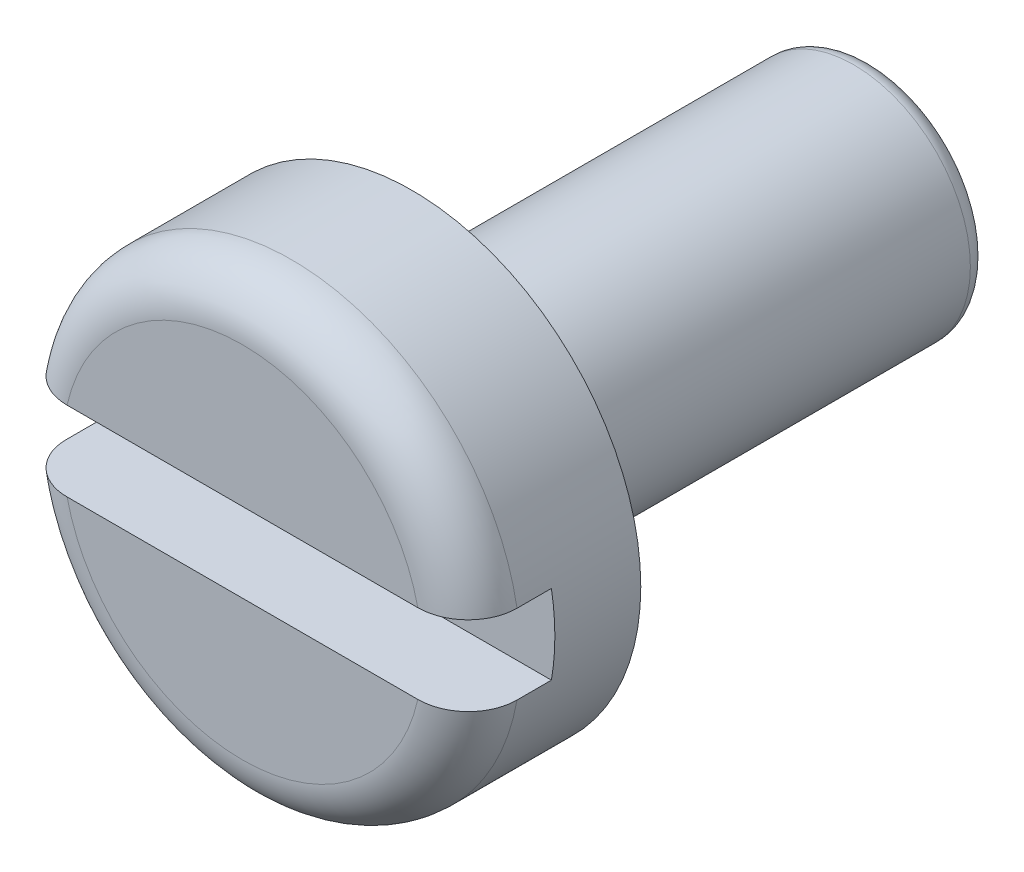
ISO-10303-21;
HEADER;
FILE_DESCRIPTION(('STEP AP214'),'2;1');
FILE_NAME('part.step','',(''),(''),'','','');
FILE_SCHEMA(('AUTOMOTIVE_DESIGN { 1 0 10303 214 1 1 1 1 }'));
ENDSEC;
DATA;
#1=APPLICATION_CONTEXT('core data for automotive mechanical design processes');
#2=APPLICATION_PROTOCOL_DEFINITION('international standard','automotive_design',2000,#1);
#3=PRODUCT_CONTEXT('',#1,'mechanical');
#4=PRODUCT('Part','Part','',(#3));
#5=PRODUCT_RELATED_PRODUCT_CATEGORY('part','',(#4));
#6=PRODUCT_DEFINITION_FORMATION('','',#4);
#7=PRODUCT_DEFINITION_CONTEXT('part definition',#1,'design');
#8=PRODUCT_DEFINITION('design','',#6,#7);
#9=PRODUCT_DEFINITION_SHAPE('','',#8);
#10=(LENGTH_UNIT() NAMED_UNIT(*) SI_UNIT(.MILLI.,.METRE.));
#11=(NAMED_UNIT(*) PLANE_ANGLE_UNIT() SI_UNIT($,.RADIAN.));
#12=(NAMED_UNIT(*) SI_UNIT($,.STERADIAN.) SOLID_ANGLE_UNIT());
#13=UNCERTAINTY_MEASURE_WITH_UNIT(LENGTH_MEASURE(1.E-05),#10,'distance_accuracy_value','');
#14=(GEOMETRIC_REPRESENTATION_CONTEXT(3) GLOBAL_UNCERTAINTY_ASSIGNED_CONTEXT((#13)) GLOBAL_UNIT_ASSIGNED_CONTEXT((#10,
#11,#12)) REPRESENTATION_CONTEXT('',''));
#15=CARTESIAN_POINT('',(0.,0.,0.));
#16=DIRECTION('',(0.,0.,1.));
#17=DIRECTION('',(1.,0.,0.));
#18=AXIS2_PLACEMENT_3D('',#15,#16,#17);
#19=CARTESIAN_POINT('',(19.4446915004468,16.1091221627203,1.778));
#20=DIRECTION('',(0.,0.,1.));
#21=DIRECTION('',(1.,0.,0.));
#22=AXIS2_PLACEMENT_3D('',#19,#20,#21);
#23=PLANE('',#22);
#24=DIRECTION('',(1.,0.,0.));
#25=VECTOR('',#24,1.);
#26=CARTESIAN_POINT('',(23.6792892297838,16.9310847197979,1.778));
#27=LINE('',#26,#25);
#28=CARTESIAN_POINT('',(14.3488028620188,16.9310847197979,1.778));
#29=VERTEX_POINT('',#28);
#30=CARTESIAN_POINT('',(23.6792892297839,16.9310847197979,1.778));
#31=VERTEX_POINT('',#30);
#32=EDGE_CURVE('E78',#29,#31,#27,.T.);
#33=ORIENTED_EDGE('',*,*,#32,.F.);
#34=CARTESIAN_POINT('',(19.0140460459013,16.1091221627203,1.778));
#35=DIRECTION('',(0.,0.,1.));
#36=DIRECTION('',(1.,0.,0.));
#37=AXIS2_PLACEMENT_3D('',#34,#35,#36);
#38=CIRCLE('',#37,4.7371);
#39=CARTESIAN_POINT('',(14.3488028620188,15.2871596056426,1.778));
#40=VERTEX_POINT('',#39);
#41=EDGE_CURVE('E84',#29,#40,#38,.T.);
#42=ORIENTED_EDGE('',*,*,#41,.T.);
#43=DIRECTION('',(1.,0.,0.));
#44=VECTOR('',#43,1.);
#45=CARTESIAN_POINT('',(14.3488028620188,15.2871596056426,1.778));
#46=LINE('',#45,#44);
#47=CARTESIAN_POINT('',(23.6792892297839,15.2871596056426,1.778));
#48=VERTEX_POINT('',#47);
#49=EDGE_CURVE('E81',#48,#40,#46,.F.);
#50=ORIENTED_EDGE('',*,*,#49,.F.);
#51=CARTESIAN_POINT('',(19.0140460459013,16.1091221627203,1.778));
#52=DIRECTION('',(0.,0.,1.));
#53=DIRECTION('',(1.,0.,0.));
#54=AXIS2_PLACEMENT_3D('',#51,#52,#53);
#55=CIRCLE('',#54,4.7371);
#56=EDGE_CURVE('E75',#48,#31,#55,.T.);
#57=ORIENTED_EDGE('',*,*,#56,.T.);
#58=EDGE_LOOP('',(#33,#42,#50,#57));
#59=FACE_BOUND('',#58,.T.);
#60=ADVANCED_FACE('F17',(#59),#23,.T.);
#61=CARTESIAN_POINT('',(23.6792892297838,16.9310847197979,1.778));
#62=DIRECTION('',(0.,-1.,0.));
#63=DIRECTION('',(0.,0.,-1.));
#64=AXIS2_PLACEMENT_3D('',#61,#62,#63);
#65=PLANE('',#64);
#66=CARTESIAN_POINT('',(23.6792892297839,16.9310847197979,2.4892));
#67=CARTESIAN_POINT('',(23.6792892063526,16.9310847197979,2.5174491265254));
#68=CARTESIAN_POINT('',(23.6780921407475,16.9310847197979,2.54568462066357));
#69=CARTESIAN_POINT('',(23.6733177682975,16.9310847197979,2.60195160658094));
#70=CARTESIAN_POINT('',(23.669740630884,16.9310847197979,2.62998311273794));
#71=CARTESIAN_POINT('',(23.6554788134015,16.9310847197979,2.71340034037747));
#72=CARTESIAN_POINT('',(23.6412635978045,16.9310847197979,2.76822409391845));
#73=CARTESIAN_POINT('',(23.6038416377336,16.9310847197979,2.87469974773668));
#74=CARTESIAN_POINT('',(23.5806316532308,16.9310847197979,2.92635049728215));
#75=CARTESIAN_POINT('',(23.5259159560777,16.9310847197979,3.0250549750456));
#76=CARTESIAN_POINT('',(23.4944108541394,16.9310847197979,3.07210904133609));
#77=CARTESIAN_POINT('',(23.423842707384,16.9310847197979,3.16058570299452));
#78=CARTESIAN_POINT('',(23.3847376396854,16.9310847197979,3.20197469914298));
#79=CARTESIAN_POINT('',(23.3001945964242,16.9310847197979,3.27772845351746));
#80=CARTESIAN_POINT('',(23.2547558661494,16.9310847197979,3.31209237343764));
#81=CARTESIAN_POINT('',(23.1825224581939,16.9310847197979,3.3579131409865));
#82=CARTESIAN_POINT('',(23.157553528936,16.9310847197979,3.37232219211086));
#83=CARTESIAN_POINT('',(23.1065314402984,16.9310847197979,3.39900777366857));
#84=CARTESIAN_POINT('',(23.0804792844545,16.9310847197979,3.41128622569577));
#85=CARTESIAN_POINT('',(23.0009220754235,16.9310847197979,3.44482606750229));
#86=CARTESIAN_POINT('',(22.9459850058441,16.9310847197979,3.46281170821925));
#87=CARTESIAN_POINT('',(22.8495800082993,16.9310847197979,3.48584980100737));
#88=CARTESIAN_POINT('',(22.8086154967982,16.9310847197979,3.49310803437703));
#89=CARTESIAN_POINT('',(22.7261829381709,16.9310847197979,3.50278163768648));
#90=CARTESIAN_POINT('',(22.6847157766486,16.9310847197979,3.50520454786139));
#91=CARTESIAN_POINT('',(22.6432281527627,16.9310847197979,3.5052));
#92=B_SPLINE_CURVE_WITH_KNOTS('',3,(#66,#67,#68,#69,#70,#71,#72,#73,#74,#75,#76,#77,#78,#79,#80,
#81,#82,#83,#84,#85,#86,#87,#88,#89,#90,#91),.UNSPECIFIED.,.F.,.F.,(4,2,2,2,2,2,2,2,2,2,2,2,4),
(0.,0.0846949954202175,0.169383962262638,0.338420356504397,0.507517696459946,0.676602590426454,
0.846650474593889,1.01671863883047,1.1031162576973,1.18943554463901,1.36196445926495,
1.48650931461939,1.61085980166377),.UNSPECIFIED.);
#93=CARTESIAN_POINT('',(23.6792892297839,16.9310847197979,2.4892));
#94=VERTEX_POINT('',#93);
#95=CARTESIAN_POINT('',(22.6432281527627,16.9310847197979,3.5052));
#96=VERTEX_POINT('',#95);
#97=EDGE_CURVE('E94',#94,#96,#92,.T.);
#98=ORIENTED_EDGE('',*,*,#97,.T.);
#99=DIRECTION('',(1.,0.,0.));
#100=VECTOR('',#99,1.);
#101=CARTESIAN_POINT('',(19.0140460459013,16.9310847197979,3.5052));
#102=LINE('',#101,#100);
#103=CARTESIAN_POINT('',(15.38486393904,16.9310847197979,3.5052));
#104=VERTEX_POINT('',#103);
#105=EDGE_CURVE('E112',#104,#96,#102,.T.);
#106=ORIENTED_EDGE('',*,*,#105,.F.);
#107=CARTESIAN_POINT('',(15.38486393904,16.9310847197979,3.5052));
#108=CARTESIAN_POINT('',(15.3256062304906,16.9310847197979,3.50524216652295));
#109=CARTESIAN_POINT('',(15.2663582470057,16.9310847197979,3.5002695278891));
#110=CARTESIAN_POINT('',(15.1495113734863,16.9310847197979,3.48054079903096));
#111=CARTESIAN_POINT('',(15.0919125817738,16.9310847197979,3.46578412676145));
#112=CARTESIAN_POINT('',(14.9799482453991,16.9310847197979,3.42671507373036));
#113=CARTESIAN_POINT('',(14.9255858106557,16.9310847197979,3.40239366727017));
#114=CARTESIAN_POINT('',(14.8478224559974,16.9310847197979,3.35927752785438));
#115=CARTESIAN_POINT('',(14.8225319564271,16.9310847197979,3.34380026680798));
#116=CARTESIAN_POINT('',(14.7733472613481,16.9310847197979,3.31071421394008));
#117=CARTESIAN_POINT('',(14.7494545187289,16.9310847197979,3.29310326065578));
#118=CARTESIAN_POINT('',(14.6809163919177,16.9310847197979,3.23783984789326));
#119=CARTESIAN_POINT('',(14.6385606762497,16.9310847197979,3.19728367060158));
#120=CARTESIAN_POINT('',(14.5614320007916,16.9310847197979,3.10951213269995));
#121=CARTESIAN_POINT('',(14.5266577316589,16.9310847197979,3.0622979242787));
#122=CARTESIAN_POINT('',(14.481279667257,16.9310847197979,2.98800438802019));
#123=CARTESIAN_POINT('',(14.467375925529,16.9310847197979,2.96289246214314));
#124=CARTESIAN_POINT('',(14.4417679831849,16.9310847197979,2.91160143652602));
#125=CARTESIAN_POINT('',(14.4300618658813,16.9310847197979,2.88542329118597));
#126=CARTESIAN_POINT('',(14.398380586863,16.9310847197979,2.80554479843874));
#127=CARTESIAN_POINT('',(14.3818031741195,16.9310847197979,2.75043595226765));
#128=CARTESIAN_POINT('',(14.3629904488666,16.9310847197979,2.6606309180588));
#129=CARTESIAN_POINT('',(14.3576729807538,16.9310847197979,2.626538486424));
#130=CARTESIAN_POINT('',(14.3505813456247,16.9310847197979,2.55803805796265));
#131=CARTESIAN_POINT('',(14.3488019495207,16.9310847197979,2.52363060245309));
#132=CARTESIAN_POINT('',(14.3488028620188,16.9310847197978,2.48920000000004));
#133=B_SPLINE_CURVE_WITH_KNOTS('',3,(#107,#108,#109,#110,#111,#112,#113,#114,#115,#116,#117,
#118,#119,#120,#121,#122,#123,#124,#125,#126,#127,#128,#129,#130,#131,#132),.UNSPECIFIED.,.F.,
.F.,(4,2,2,2,2,2,2,2,2,2,2,2,4),(0.,0.177544868014859,0.355100298995844,0.532823682587418,
0.621681052678553,0.710629201323233,0.885644800059263,1.06063014899723,1.14664985557212,
1.23259418678876,1.40425921867969,1.5076123091705,1.61081253525624),.UNSPECIFIED.);
#134=CARTESIAN_POINT('',(14.3488028620188,16.9310847197979,2.4892));
#135=VERTEX_POINT('',#134);
#136=EDGE_CURVE('E100',#104,#135,#133,.T.);
#137=ORIENTED_EDGE('',*,*,#136,.T.);
#138=DIRECTION('',(0.,0.,-1.));
#139=VECTOR('',#138,1.);
#140=CARTESIAN_POINT('',(14.3488028620188,16.9310847197979,1.778));
#141=LINE('',#140,#139);
#142=EDGE_CURVE('E98',#135,#29,#141,.T.);
#143=ORIENTED_EDGE('',*,*,#142,.T.);
#144=ORIENTED_EDGE('',*,*,#32,.T.);
#145=DIRECTION('',(0.,0.,-1.));
#146=VECTOR('',#145,1.);
#147=CARTESIAN_POINT('',(23.6792892297838,16.9310847197979,1.778));
#148=LINE('',#147,#146);
#149=EDGE_CURVE('E88',#31,#94,#148,.F.);
#150=ORIENTED_EDGE('',*,*,#149,.T.);
#151=EDGE_LOOP('',(#98,#106,#137,#143,#144,#150));
#152=FACE_BOUND('',#151,.T.);
#153=ADVANCED_FACE('F96',(#152),#65,.T.);
#154=CARTESIAN_POINT('',(14.3488028620188,15.2871596056426,1.778));
#155=DIRECTION('',(0.,1.,0.));
#156=DIRECTION('',(0.,0.,1.));
#157=AXIS2_PLACEMENT_3D('',#154,#155,#156);
#158=PLANE('',#157);
#159=CARTESIAN_POINT('',(14.3488028620188,15.2871596056426,2.4892));
#160=CARTESIAN_POINT('',(14.34880288545,15.2871596056426,2.5174491265254));
#161=CARTESIAN_POINT('',(14.3499999510552,15.2871596056426,2.54568462066357));
#162=CARTESIAN_POINT('',(14.3547743235051,15.2871596056426,2.60195160658093));
#163=CARTESIAN_POINT('',(14.3583514609186,15.2871596056426,2.62998311273793));
#164=CARTESIAN_POINT('',(14.3726132784011,15.2871596056426,2.71340034037747));
#165=CARTESIAN_POINT('',(14.3868284939981,15.2871596056426,2.76822409391845));
#166=CARTESIAN_POINT('',(14.4242504540691,15.2871596056426,2.87469974773668));
#167=CARTESIAN_POINT('',(14.4474604385719,15.2871596056426,2.92635049728215));
#168=CARTESIAN_POINT('',(14.502176135725,15.2871596056426,3.0250549750456));
#169=CARTESIAN_POINT('',(14.5336812376632,15.2871596056426,3.07210904133609));
#170=CARTESIAN_POINT('',(14.6042493844186,15.2871596056426,3.16058570299452));
#171=CARTESIAN_POINT('',(14.6433544521173,15.2871596056426,3.20197469914298));
#172=CARTESIAN_POINT('',(14.7278974953785,15.2871596056426,3.27772845351746));
#173=CARTESIAN_POINT('',(14.7733362256533,15.2871596056426,3.31209237343764));
#174=CARTESIAN_POINT('',(14.8455696336087,15.2871596056426,3.3579131409865));
#175=CARTESIAN_POINT('',(14.8705385628666,15.2871596056426,3.37232219211086));
#176=CARTESIAN_POINT('',(14.9215606515043,15.2871596056426,3.39900777366857));
#177=CARTESIAN_POINT('',(14.9476128073482,15.2871596056426,3.41128622569577));
#178=CARTESIAN_POINT('',(15.0271700163792,15.2871596056426,3.44482606750229));
#179=CARTESIAN_POINT('',(15.0821070859585,15.2871596056426,3.46281170821925));
#180=CARTESIAN_POINT('',(15.1785120835034,15.2871596056426,3.48584980100737));
#181=CARTESIAN_POINT('',(15.2194765950045,15.2871596056426,3.49310803437703));
#182=CARTESIAN_POINT('',(15.3019091536318,15.2871596056426,3.50278163768648));
#183=CARTESIAN_POINT('',(15.343376315154,15.2871596056426,3.50520454786139));
#184=CARTESIAN_POINT('',(15.38486393904,15.2871596056426,3.5052));
#185=B_SPLINE_CURVE_WITH_KNOTS('',3,(#159,#160,#161,#162,#163,#164,#165,#166,#167,#168,#169,
#170,#171,#172,#173,#174,#175,#176,#177,#178,#179,#180,#181,#182,#183,#184),.UNSPECIFIED.,.F.,
.F.,(4,2,2,2,2,2,2,2,2,2,2,2,4),(0.,0.0846949954202172,0.169383962262637,0.338420356504396,
0.507517696459945,0.676602590426453,0.846650474593889,1.01671863883047,1.1031162576973,
1.18943554463901,1.36196445926495,1.4865093146194,1.61085980166377),.UNSPECIFIED.);
#186=CARTESIAN_POINT('',(14.3488028620188,15.2871596056426,2.4892));
#187=VERTEX_POINT('',#186);
#188=CARTESIAN_POINT('',(15.38486393904,15.2871596056426,3.5052));
#189=VERTEX_POINT('',#188);
#190=EDGE_CURVE('E110',#187,#189,#185,.T.);
#191=ORIENTED_EDGE('',*,*,#190,.T.);
#192=DIRECTION('',(1.,0.,0.));
#193=VECTOR('',#192,1.);
#194=CARTESIAN_POINT('',(19.0140460459013,15.2871596056426,3.5052));
#195=LINE('',#194,#193);
#196=CARTESIAN_POINT('',(22.6432281527627,15.2871596056426,3.5052));
#197=VERTEX_POINT('',#196);
#198=EDGE_CURVE('E161',#197,#189,#195,.F.);
#199=ORIENTED_EDGE('',*,*,#198,.F.);
#200=CARTESIAN_POINT('',(22.6432281527627,15.2871596056426,3.5052));
#201=CARTESIAN_POINT('',(22.702485861312,15.2871596056426,3.50524216652295));
#202=CARTESIAN_POINT('',(22.761733844797,15.2871596056426,3.5002695278891));
#203=CARTESIAN_POINT('',(22.8785807183163,15.2871596056426,3.48054079903096));
#204=CARTESIAN_POINT('',(22.9361795100289,15.2871596056426,3.46578412676145));
#205=CARTESIAN_POINT('',(23.0481438464036,15.2871596056426,3.42671507373036));
#206=CARTESIAN_POINT('',(23.102506281147,15.2871596056426,3.40239366727016));
#207=CARTESIAN_POINT('',(23.1802696358053,15.2871596056426,3.35927752785438));
#208=CARTESIAN_POINT('',(23.2055601353756,15.2871596056426,3.34380026680798));
#209=CARTESIAN_POINT('',(23.2547448304546,15.2871596056426,3.31071421394008));
#210=CARTESIAN_POINT('',(23.2786375730738,15.2871596056426,3.29310326065578));
#211=CARTESIAN_POINT('',(23.3471756998849,15.2871596056426,3.23783984789326));
#212=CARTESIAN_POINT('',(23.389531415553,15.2871596056426,3.19728367060158));
#213=CARTESIAN_POINT('',(23.4666600910111,15.2871596056426,3.10951213269995));
#214=CARTESIAN_POINT('',(23.5014343601437,15.2871596056426,3.0622979242787));
#215=CARTESIAN_POINT('',(23.5468124245456,15.2871596056426,2.98800438802019));
#216=CARTESIAN_POINT('',(23.5607161662736,15.2871596056426,2.96289246214314));
#217=CARTESIAN_POINT('',(23.5863241086178,15.2871596056426,2.91160143652602));
#218=CARTESIAN_POINT('',(23.5980302259213,15.2871596056426,2.88542329118597));
#219=CARTESIAN_POINT('',(23.6297115049397,15.2871596056426,2.80554479843874));
#220=CARTESIAN_POINT('',(23.6462889176832,15.2871596056426,2.75043595226765));
#221=CARTESIAN_POINT('',(23.665101642936,15.2871596056426,2.6606309180588));
#222=CARTESIAN_POINT('',(23.6704191110488,15.2871596056426,2.62653848642399));
#223=CARTESIAN_POINT('',(23.677510746178,15.2871596056426,2.55803805796265));
#224=CARTESIAN_POINT('',(23.679290142282,15.2871596056426,2.52363060245309));
#225=CARTESIAN_POINT('',(23.6792892297839,15.2871596056427,2.48920000000004));
#226=B_SPLINE_CURVE_WITH_KNOTS('',3,(#200,#201,#202,#203,#204,#205,#206,#207,#208,#209,#210,
#211,#212,#213,#214,#215,#216,#217,#218,#219,#220,#221,#222,#223,#224,#225),.UNSPECIFIED.,.F.,
.F.,(4,2,2,2,2,2,2,2,2,2,2,2,4),(0.,0.177544868014855,0.35510029899584,0.532823682587413,
0.621681052678549,0.710629201323226,0.885644800059253,1.06063014899722,1.14664985557211,
1.23259418678875,1.40425921867969,1.50761230917049,1.61081253525623),.UNSPECIFIED.);
#227=CARTESIAN_POINT('',(23.6792892297839,15.2871596056426,2.4892));
#228=VERTEX_POINT('',#227);
#229=EDGE_CURVE('E121',#197,#228,#226,.T.);
#230=ORIENTED_EDGE('',*,*,#229,.T.);
#231=DIRECTION('',(0.,0.,1.));
#232=VECTOR('',#231,1.);
#233=CARTESIAN_POINT('',(23.6792892297838,15.2871596056426,1.778));
#234=LINE('',#233,#232);
#235=EDGE_CURVE('E204',#228,#48,#234,.F.);
#236=ORIENTED_EDGE('',*,*,#235,.T.);
#237=ORIENTED_EDGE('',*,*,#49,.T.);
#238=DIRECTION('',(0.,0.,1.));
#239=VECTOR('',#238,1.);
#240=CARTESIAN_POINT('',(14.3488028620188,15.2871596056426,1.778));
#241=LINE('',#240,#239);
#242=EDGE_CURVE('E113',#40,#187,#241,.T.);
#243=ORIENTED_EDGE('',*,*,#242,.T.);
#244=EDGE_LOOP('',(#191,#199,#230,#236,#237,#243));
#245=FACE_BOUND('',#244,.T.);
#246=ADVANCED_FACE('F123',(#245),#158,.T.);
#247=CARTESIAN_POINT('',(19.0140460459013,18.2623661873274,3.5052));
#248=DIRECTION('',(0.,0.,1.));
#249=DIRECTION('',(1.,0.,0.));
#250=AXIS2_PLACEMENT_3D('',#247,#248,#249);
#251=PLANE('',#250);
#252=CARTESIAN_POINT('',(19.0140460459013,16.1091221627203,3.5052));
#253=DIRECTION('',(0.,0.,-1.));
#254=DIRECTION('',(-0.975298193238915,0.220892359000731,0.));
#255=AXIS2_PLACEMENT_3D('',#252,#253,#254);
#256=CIRCLE('',#255,3.7211);
#257=EDGE_CURVE('E193',#104,#96,#256,.T.);
#258=ORIENTED_EDGE('',*,*,#257,.F.);
#259=ORIENTED_EDGE('',*,*,#105,.T.);
#260=EDGE_LOOP('',(#258,#259));
#261=FACE_BOUND('',#260,.T.);
#262=ADVANCED_FACE('F171',(#261),#251,.T.);
#263=CARTESIAN_POINT('',(19.0140460459013,13.9558781381131,3.5052));
#264=DIRECTION('',(0.,0.,1.));
#265=DIRECTION('',(1.,0.,0.));
#266=AXIS2_PLACEMENT_3D('',#263,#264,#265);
#267=PLANE('',#266);
#268=CARTESIAN_POINT('',(19.0140460459013,16.1091221627203,3.5052));
#269=DIRECTION('',(0.,0.,-1.));
#270=DIRECTION('',(0.975298193238914,-0.220892359000736,0.));
#271=AXIS2_PLACEMENT_3D('',#268,#269,#270);
#272=CIRCLE('',#271,3.7211);
#273=EDGE_CURVE('E152',#197,#189,#272,.T.);
#274=ORIENTED_EDGE('',*,*,#273,.F.);
#275=ORIENTED_EDGE('',*,*,#198,.T.);
#276=EDGE_LOOP('',(#274,#275));
#277=FACE_BOUND('',#276,.T.);
#278=ADVANCED_FACE('F163',(#277),#267,.T.);
#279=CARTESIAN_POINT('',(19.0140460459013,16.1091221627203,2.4892));
#280=DIRECTION('',(0.,0.,-1.));
#281=DIRECTION('',(-1.,0.,0.));
#282=AXIS2_PLACEMENT_3D('',#279,#280,#281);
#283=TOROIDAL_SURFACE('',#282,3.7211,1.016);
#284=ORIENTED_EDGE('',*,*,#136,.F.);
#285=ORIENTED_EDGE('',*,*,#257,.T.);
#286=ORIENTED_EDGE('',*,*,#97,.F.);
#287=CARTESIAN_POINT('',(19.0140460459013,16.1091221627203,2.4892));
#288=DIRECTION('',(0.,0.,1.));
#289=DIRECTION('',(1.,0.,0.));
#290=AXIS2_PLACEMENT_3D('',#287,#288,#289);
#291=CIRCLE('',#290,4.7371);
#292=EDGE_CURVE('E92',#135,#94,#291,.F.);
#293=ORIENTED_EDGE('',*,*,#292,.F.);
#294=EDGE_LOOP('',(#284,#285,#286,#293));
#295=FACE_BOUND('',#294,.T.);
#296=ADVANCED_FACE('F132',(#295),#283,.T.);
#297=CARTESIAN_POINT('',(19.0140460459013,16.1091221627203,2.4892));
#298=DIRECTION('',(0.,0.,-1.));
#299=DIRECTION('',(-1.,0.,0.));
#300=AXIS2_PLACEMENT_3D('',#297,#298,#299);
#301=TOROIDAL_SURFACE('',#300,3.7211,1.016);
#302=ORIENTED_EDGE('',*,*,#229,.F.);
#303=ORIENTED_EDGE('',*,*,#273,.T.);
#304=ORIENTED_EDGE('',*,*,#190,.F.);
#305=CARTESIAN_POINT('',(19.0140460459013,16.1091221627203,2.4892));
#306=DIRECTION('',(0.,0.,1.));
#307=DIRECTION('',(1.,0.,0.));
#308=AXIS2_PLACEMENT_3D('',#305,#306,#307);
#309=CIRCLE('',#308,4.7371);
#310=EDGE_CURVE('E147',#228,#187,#309,.F.);
#311=ORIENTED_EDGE('',*,*,#310,.F.);
#312=EDGE_LOOP('',(#302,#303,#304,#311));
#313=FACE_BOUND('',#312,.T.);
#314=ADVANCED_FACE('F126',(#313),#301,.T.);
#315=CARTESIAN_POINT('',(19.0140460459013,16.1091221627203,0.));
#316=DIRECTION('',(0.,0.,1.));
#317=DIRECTION('',(1.,0.,0.));
#318=AXIS2_PLACEMENT_3D('',#315,#316,#317);
#319=CYLINDRICAL_SURFACE('',#318,4.7371);
#320=CARTESIAN_POINT('',(19.0140460459013,16.1091221627203,0.));
#321=DIRECTION('',(0.,0.,1.));
#322=DIRECTION('',(1.,0.,0.));
#323=AXIS2_PLACEMENT_3D('',#320,#321,#322);
#324=CIRCLE('',#323,4.7371);
#325=CARTESIAN_POINT('',(23.7511460459013,16.1091221627203,0.));
#326=VERTEX_POINT('',#325);
#327=EDGE_CURVE('E107',#326,#326,#324,.T.);
#328=ORIENTED_EDGE('',*,*,#327,.T.);
#329=EDGE_LOOP('',(#328));
#330=FACE_BOUND('',#329,.T.);
#331=ORIENTED_EDGE('',*,*,#242,.F.);
#332=ORIENTED_EDGE('',*,*,#41,.F.);
#333=ORIENTED_EDGE('',*,*,#142,.F.);
#334=ORIENTED_EDGE('',*,*,#292,.T.);
#335=ORIENTED_EDGE('',*,*,#149,.F.);
#336=ORIENTED_EDGE('',*,*,#56,.F.);
#337=ORIENTED_EDGE('',*,*,#235,.F.);
#338=ORIENTED_EDGE('',*,*,#310,.T.);
#339=EDGE_LOOP('',(#331,#332,#333,#334,#335,#336,#337,#338));
#340=FACE_BOUND('',#339,.T.);
#341=ADVANCED_FACE('F90',(#330,#340),#319,.T.);
#342=CARTESIAN_POINT('',(18.7946824095377,16.1091221627203,-9.525));
#343=DIRECTION('',(0.,0.,1.));
#344=DIRECTION('',(1.,0.,0.));
#345=AXIS2_PLACEMENT_3D('',#342,#343,#344);
#346=PLANE('',#345);
#347=CARTESIAN_POINT('',(19.0140460459013,16.1091221627203,-9.525));
#348=DIRECTION('',(0.,0.,1.));
#349=DIRECTION('',(1.,0.,0.));
#350=AXIS2_PLACEMENT_3D('',#347,#348,#349);
#351=CIRCLE('',#350,2.032);
#352=CARTESIAN_POINT('',(21.0460460459013,16.1091221627203,-9.525));
#353=VERTEX_POINT('',#352);
#354=CARTESIAN_POINT('',(16.9820460459013,16.1091221627203,-9.525));
#355=VERTEX_POINT('',#354);
#356=EDGE_CURVE('E36',#353,#355,#351,.T.);
#357=ORIENTED_EDGE('',*,*,#356,.F.);
#358=CARTESIAN_POINT('',(19.0140460459013,16.1091221627203,-9.525));
#359=DIRECTION('',(0.,0.,1.));
#360=DIRECTION('',(-1.,0.,0.));
#361=AXIS2_PLACEMENT_3D('',#358,#359,#360);
#362=CIRCLE('',#361,2.032);
#363=EDGE_CURVE('E106',#355,#353,#362,.T.);
#364=ORIENTED_EDGE('',*,*,#363,.F.);
#365=EDGE_LOOP('',(#357,#364));
#366=FACE_BOUND('',#365,.T.);
#367=ADVANCED_FACE('F255',(#366),#346,.F.);
#368=CARTESIAN_POINT('',(19.4446915004468,16.1091221627203,0.));
#369=DIRECTION('',(0.,0.,1.));
#370=DIRECTION('',(1.,0.,0.));
#371=AXIS2_PLACEMENT_3D('',#368,#369,#370);
#372=PLANE('',#371);
#373=CARTESIAN_POINT('',(19.0140460459013,16.1091221627203,0.));
#374=DIRECTION('',(0.,0.,-1.));
#375=DIRECTION('',(-1.,0.,0.));
#376=AXIS2_PLACEMENT_3D('',#373,#374,#375);
#377=CIRCLE('',#376,2.413);
#378=CARTESIAN_POINT('',(16.6010460459013,16.1091221627203,0.));
#379=VERTEX_POINT('',#378);
#380=EDGE_CURVE('E28',#379,#379,#377,.T.);
#381=ORIENTED_EDGE('',*,*,#380,.F.);
#382=EDGE_LOOP('',(#381));
#383=FACE_BOUND('',#382,.T.);
#384=ORIENTED_EDGE('',*,*,#327,.F.);
#385=EDGE_LOOP('',(#384));
#386=FACE_BOUND('',#385,.T.);
#387=ADVANCED_FACE('F241',(#383,#386),#372,.F.);
#388=CARTESIAN_POINT('',(19.0140460459013,16.1091221627203,-9.144));
#389=DIRECTION('',(0.,0.,1.));
#390=DIRECTION('',(1.,0.,0.));
#391=AXIS2_PLACEMENT_3D('',#388,#389,#390);
#392=TOROIDAL_SURFACE('',#391,2.032,0.381);
#393=ORIENTED_EDGE('',*,*,#363,.T.);
#394=ORIENTED_EDGE('',*,*,#356,.T.);
#395=EDGE_LOOP('',(#393,#394));
#396=FACE_BOUND('',#395,.T.);
#397=CARTESIAN_POINT('',(19.0140460459013,16.1091221627203,-9.144));
#398=DIRECTION('',(0.,0.,-1.));
#399=DIRECTION('',(-1.,0.,0.));
#400=AXIS2_PLACEMENT_3D('',#397,#398,#399);
#401=CIRCLE('',#400,2.413);
#402=CARTESIAN_POINT('',(16.6010460459013,16.1091221627203,-9.144));
#403=VERTEX_POINT('',#402);
#404=EDGE_CURVE('E11',#403,#403,#401,.F.);
#405=ORIENTED_EDGE('',*,*,#404,.F.);
#406=EDGE_LOOP('',(#405));
#407=FACE_BOUND('',#406,.T.);
#408=ADVANCED_FACE('F235',(#396,#407),#392,.T.);
#409=CARTESIAN_POINT('',(19.0140460459013,16.1091221627203,0.));
#410=DIRECTION('',(0.,0.,-1.));
#411=DIRECTION('',(-1.,0.,0.));
#412=AXIS2_PLACEMENT_3D('',#409,#410,#411);
#413=CYLINDRICAL_SURFACE('',#412,2.413);
#414=ORIENTED_EDGE('',*,*,#380,.T.);
#415=EDGE_LOOP('',(#414));
#416=FACE_BOUND('',#415,.T.);
#417=ORIENTED_EDGE('',*,*,#404,.T.);
#418=EDGE_LOOP('',(#417));
#419=FACE_BOUND('',#418,.T.);
#420=ADVANCED_FACE('F233',(#416,#419),#413,.T.);
#421=CLOSED_SHELL('',(#60,#153,#246,#262,#278,#296,#314,#341,#367,#387,#408,#420));
#422=MANIFOLD_SOLID_BREP('B1',#421);
#423=ADVANCED_BREP_SHAPE_REPRESENTATION('',(#18,#422),#14);
#424=SHAPE_DEFINITION_REPRESENTATION(#9,#423);
ENDSEC;
END-ISO-10303-21;
